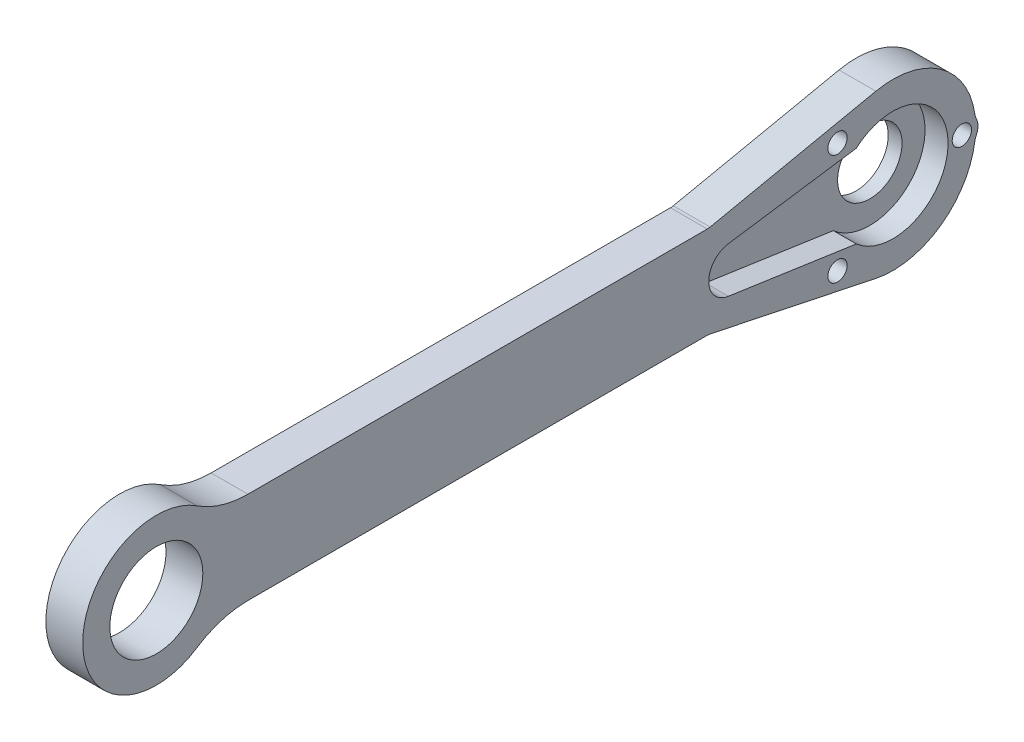
ISO-10303-21;
HEADER;
FILE_DESCRIPTION(('STEP AP214'),'2;1');
FILE_NAME('part.step','',(''),(''),'','','');
FILE_SCHEMA(('AUTOMOTIVE_DESIGN { 1 0 10303 214 1 1 1 1 }'));
ENDSEC;
DATA;
#1=APPLICATION_CONTEXT('core data for automotive mechanical design processes');
#2=APPLICATION_PROTOCOL_DEFINITION('international standard','automotive_design',2000,#1);
#3=PRODUCT_CONTEXT('',#1,'mechanical');
#4=PRODUCT('Part','Part','',(#3));
#5=PRODUCT_RELATED_PRODUCT_CATEGORY('part','',(#4));
#6=PRODUCT_DEFINITION_FORMATION('','',#4);
#7=PRODUCT_DEFINITION_CONTEXT('part definition',#1,'design');
#8=PRODUCT_DEFINITION('design','',#6,#7);
#9=PRODUCT_DEFINITION_SHAPE('','',#8);
#10=(LENGTH_UNIT() NAMED_UNIT(*) SI_UNIT(.MILLI.,.METRE.));
#11=(NAMED_UNIT(*) PLANE_ANGLE_UNIT() SI_UNIT($,.RADIAN.));
#12=(NAMED_UNIT(*) SI_UNIT($,.STERADIAN.) SOLID_ANGLE_UNIT());
#13=UNCERTAINTY_MEASURE_WITH_UNIT(LENGTH_MEASURE(1.E-05),#10,'distance_accuracy_value','');
#14=(GEOMETRIC_REPRESENTATION_CONTEXT(3) GLOBAL_UNCERTAINTY_ASSIGNED_CONTEXT((#13)) GLOBAL_UNIT_ASSIGNED_CONTEXT((#10,
#11,#12)) REPRESENTATION_CONTEXT('',''));
#15=CARTESIAN_POINT('',(0.,0.,0.));
#16=DIRECTION('',(0.,0.,1.));
#17=DIRECTION('',(1.,0.,0.));
#18=AXIS2_PLACEMENT_3D('',#15,#16,#17);
#19=CARTESIAN_POINT('',(4.,0.,0.));
#20=DIRECTION('',(1.,0.,0.));
#21=DIRECTION('',(0.,0.,-1.));
#22=AXIS2_PLACEMENT_3D('',#19,#20,#21);
#23=PLANE('',#22);
#24=CARTESIAN_POINT('',(4.,6.01040764008562,-33.9895923599143));
#25=DIRECTION('',(1.,0.,0.));
#26=DIRECTION('',(0.,0.,-1.));
#27=AXIS2_PLACEMENT_3D('',#24,#25,#26);
#28=CIRCLE('',#27,1.05);
#29=CARTESIAN_POINT('',(4.,6.01040764008562,-35.0395923599143));
#30=VERTEX_POINT('',#29);
#31=EDGE_CURVE('E468',#30,#30,#28,.T.);
#32=ORIENTED_EDGE('',*,*,#31,.F.);
#33=EDGE_LOOP('',(#32));
#34=FACE_BOUND('',#33,.T.);
#35=CARTESIAN_POINT('',(4.,0.,-47.5));
#36=DIRECTION('',(1.,0.,0.));
#37=DIRECTION('',(0.,0.,-1.));
#38=AXIS2_PLACEMENT_3D('',#35,#36,#37);
#39=CIRCLE('',#38,1.75);
#40=CARTESIAN_POINT('',(4.,0.794417713041588,-49.0592948717949));
#41=VERTEX_POINT('',#40);
#42=CARTESIAN_POINT('',(4.,-0.794417713041585,-49.0592948717949));
#43=VERTEX_POINT('',#42);
#44=EDGE_CURVE('E210',#41,#43,#39,.F.);
#45=ORIENTED_EDGE('',*,*,#44,.F.);
#46=CARTESIAN_POINT('',(4.,1.47534718136295,-50.3958333333333));
#47=DIRECTION('',(1.,0.,0.));
#48=DIRECTION('',(0.,0.,-1.));
#49=AXIS2_PLACEMENT_3D('',#46,#47,#48);
#50=CIRCLE('',#49,1.5);
#51=CARTESIAN_POINT('',(4.,1.2645832983111,-48.9107142857143));
#52=VERTEX_POINT('',#51);
#53=EDGE_CURVE('E296',#41,#52,#50,.F.);
#54=ORIENTED_EDGE('',*,*,#53,.T.);
#55=CARTESIAN_POINT('',(4.,0.,-40.));
#56=DIRECTION('',(1.,0.,0.));
#57=DIRECTION('',(0.,0.,-1.));
#58=AXIS2_PLACEMENT_3D('',#55,#56,#57);
#59=CIRCLE('',#58,9.);
#60=CARTESIAN_POINT('',(4.,8.80824154912577,-38.1520603872814));
#61=VERTEX_POINT('',#60);
#62=EDGE_CURVE('E213',#61,#52,#59,.F.);
#63=ORIENTED_EDGE('',*,*,#62,.F.);
#64=DIRECTION('',(0.,0.205326623635395,-0.978693505458419));
#65=VECTOR('',#64,1.);
#66=CARTESIAN_POINT('',(4.,0.770168227139119,0.161578717778108));
#67=LINE('',#66,#65);
#68=CARTESIAN_POINT('',(4.,5.03195974181237,-20.1523367559165));
#69=VERTEX_POINT('',#68);
#70=EDGE_CURVE('E217',#69,#61,#67,.T.);
#71=ORIENTED_EDGE('',*,*,#70,.F.);
#72=CARTESIAN_POINT('',(4.,6.5,-19.8443468204634));
#73=DIRECTION('',(1.,0.,0.));
#74=DIRECTION('',(0.,0.,-1.));
#75=AXIS2_PLACEMENT_3D('',#72,#73,#74);
#76=CIRCLE('',#75,1.5);
#77=CARTESIAN_POINT('',(4.,5.,-19.8443468204634));
#78=VERTEX_POINT('',#77);
#79=EDGE_CURVE('E286',#69,#78,#76,.F.);
#80=ORIENTED_EDGE('',*,*,#79,.T.);
#81=DIRECTION('',(0.,0.,-1.));
#82=VECTOR('',#81,1.);
#83=CARTESIAN_POINT('',(4.,5.,0.));
#84=LINE('',#83,#82);
#85=CARTESIAN_POINT('',(4.,5.,30.0501256289338));
#86=VERTEX_POINT('',#85);
#87=EDGE_CURVE('E219',#86,#78,#84,.T.);
#88=ORIENTED_EDGE('',*,*,#87,.F.);
#89=CARTESIAN_POINT('',(4.,15.,30.0501256289338));
#90=DIRECTION('',(1.,0.,0.));
#91=DIRECTION('',(0.,0.,-1.));
#92=AXIS2_PLACEMENT_3D('',#89,#90,#91);
#93=CIRCLE('',#92,10.);
#94=CARTESIAN_POINT('',(4.,6.66666666666667,35.5778336128595));
#95=VERTEX_POINT('',#94);
#96=EDGE_CURVE('E11',#86,#95,#93,.F.);
#97=ORIENTED_EDGE('',*,*,#96,.T.);
#98=CARTESIAN_POINT('',(4.,0.,40.));
#99=DIRECTION('',(1.,0.,0.));
#100=DIRECTION('',(0.,0.,-1.));
#101=AXIS2_PLACEMENT_3D('',#98,#99,#100);
#102=CIRCLE('',#101,8.);
#103=CARTESIAN_POINT('',(4.,-6.66666666666667,35.5778336128595));
#104=VERTEX_POINT('',#103);
#105=EDGE_CURVE('E221',#95,#104,#102,.T.);
#106=ORIENTED_EDGE('',*,*,#105,.T.);
#107=CARTESIAN_POINT('',(4.,-15.,30.0501256289338));
#108=DIRECTION('',(1.,0.,0.));
#109=DIRECTION('',(0.,0.,-1.));
#110=AXIS2_PLACEMENT_3D('',#107,#108,#109);
#111=CIRCLE('',#110,10.);
#112=CARTESIAN_POINT('',(4.,-5.,30.0501256289338));
#113=VERTEX_POINT('',#112);
#114=EDGE_CURVE('E313',#104,#113,#111,.F.);
#115=ORIENTED_EDGE('',*,*,#114,.T.);
#116=DIRECTION('',(0.,0.,-1.));
#117=VECTOR('',#116,1.);
#118=CARTESIAN_POINT('',(4.,-5.,0.));
#119=LINE('',#118,#117);
#120=CARTESIAN_POINT('',(4.,-5.,-19.8443468204634));
#121=VERTEX_POINT('',#120);
#122=EDGE_CURVE('E224',#113,#121,#119,.T.);
#123=ORIENTED_EDGE('',*,*,#122,.T.);
#124=CARTESIAN_POINT('',(4.,-6.5,-19.8443468204634));
#125=DIRECTION('',(1.,0.,0.));
#126=DIRECTION('',(0.,0.,-1.));
#127=AXIS2_PLACEMENT_3D('',#124,#125,#126);
#128=CIRCLE('',#127,1.5);
#129=CARTESIAN_POINT('',(4.,-5.03195974181237,-20.1523367559165));
#130=VERTEX_POINT('',#129);
#131=EDGE_CURVE('E292',#121,#130,#128,.F.);
#132=ORIENTED_EDGE('',*,*,#131,.T.);
#133=DIRECTION('',(0.,-0.205326623635395,-0.978693505458419));
#134=VECTOR('',#133,1.);
#135=CARTESIAN_POINT('',(4.,-0.770168227139119,0.161578717778108));
#136=LINE('',#135,#134);
#137=CARTESIAN_POINT('',(4.,-8.80824154912577,-38.1520603872814));
#138=VERTEX_POINT('',#137);
#139=EDGE_CURVE('E226',#130,#138,#136,.T.);
#140=ORIENTED_EDGE('',*,*,#139,.T.);
#141=CARTESIAN_POINT('',(4.,0.,-40.));
#142=DIRECTION('',(1.,0.,0.));
#143=DIRECTION('',(0.,0.,-1.));
#144=AXIS2_PLACEMENT_3D('',#141,#142,#143);
#145=CIRCLE('',#144,9.);
#146=CARTESIAN_POINT('',(4.,-1.26458329831109,-48.9107142857143));
#147=VERTEX_POINT('',#146);
#148=EDGE_CURVE('E228',#138,#147,#145,.T.);
#149=ORIENTED_EDGE('',*,*,#148,.T.);
#150=CARTESIAN_POINT('',(4.,-1.47534718136294,-50.3958333333333));
#151=DIRECTION('',(1.,0.,0.));
#152=DIRECTION('',(0.,0.,-1.));
#153=AXIS2_PLACEMENT_3D('',#150,#151,#152);
#154=CIRCLE('',#153,1.5);
#155=EDGE_CURVE('E300',#147,#43,#154,.F.);
#156=ORIENTED_EDGE('',*,*,#155,.T.);
#157=EDGE_LOOP('',(#45,#54,#63,#71,#80,#88,#97,#106,#115,#123,#132,#140,#149,#156));
#158=FACE_BOUND('',#157,.T.);
#159=CARTESIAN_POINT('',(4.,0.,40.));
#160=DIRECTION('',(1.,0.,0.));
#161=DIRECTION('',(0.,0.,-1.));
#162=AXIS2_PLACEMENT_3D('',#159,#160,#161);
#163=CIRCLE('',#162,5.05);
#164=CARTESIAN_POINT('',(4.,0.,34.95));
#165=VERTEX_POINT('',#164);
#166=EDGE_CURVE('E206',#165,#165,#163,.T.);
#167=ORIENTED_EDGE('',*,*,#166,.F.);
#168=EDGE_LOOP('',(#167));
#169=FACE_BOUND('',#168,.T.);
#170=DIRECTION('',(0.,-0.144322964314915,-0.989530637207032));
#171=VECTOR('',#170,1.);
#172=CARTESIAN_POINT('',(4.,-2.47382659301758,-22.1391925892127));
#173=LINE('',#172,#171);
#174=CARTESIAN_POINT('',(4.,-2.47382659301758,-22.1391925892127));
#175=VERTEX_POINT('',#174);
#176=CARTESIAN_POINT('',(4.,-4.5,-36.0313730334031));
#177=VERTEX_POINT('',#176);
#178=EDGE_CURVE('E165',#175,#177,#173,.T.);
#179=ORIENTED_EDGE('',*,*,#178,.F.);
#180=CARTESIAN_POINT('',(4.,0.,-22.5));
#181=DIRECTION('',(-1.,0.,0.));
#182=DIRECTION('',(0.,0.,1.));
#183=AXIS2_PLACEMENT_3D('',#180,#181,#182);
#184=CIRCLE('',#183,2.5);
#185=CARTESIAN_POINT('',(4.,2.47382659301758,-22.1391925892127));
#186=VERTEX_POINT('',#185);
#187=EDGE_CURVE('E183',#175,#186,#184,.T.);
#188=ORIENTED_EDGE('',*,*,#187,.T.);
#189=DIRECTION('',(0.,0.144322964314915,-0.989530637207032));
#190=VECTOR('',#189,1.);
#191=CARTESIAN_POINT('',(4.,2.47382659301758,-22.1391925892127));
#192=LINE('',#191,#190);
#193=CARTESIAN_POINT('',(4.,4.5,-36.0313730334031));
#194=VERTEX_POINT('',#193);
#195=EDGE_CURVE('E186',#186,#194,#192,.T.);
#196=ORIENTED_EDGE('',*,*,#195,.T.);
#197=CARTESIAN_POINT('',(4.,0.,-40.));
#198=DIRECTION('',(1.,0.,0.));
#199=DIRECTION('',(0.,0.,-1.));
#200=AXIS2_PLACEMENT_3D('',#197,#198,#199);
#201=CIRCLE('',#200,6.);
#202=EDGE_CURVE('E195',#177,#194,#201,.T.);
#203=ORIENTED_EDGE('',*,*,#202,.F.);
#204=EDGE_LOOP('',(#179,#188,#196,#203));
#205=FACE_BOUND('',#204,.T.);
#206=CARTESIAN_POINT('',(4.,0.,-47.5));
#207=DIRECTION('',(1.,0.,0.));
#208=DIRECTION('',(0.,0.,-1.));
#209=AXIS2_PLACEMENT_3D('',#206,#207,#208);
#210=CIRCLE('',#209,1.05);
#211=CARTESIAN_POINT('',(4.,0.,-48.55));
#212=VERTEX_POINT('',#211);
#213=EDGE_CURVE('E459',#212,#212,#210,.T.);
#214=ORIENTED_EDGE('',*,*,#213,.F.);
#215=EDGE_LOOP('',(#214));
#216=FACE_BOUND('',#215,.T.);
#217=CARTESIAN_POINT('',(4.,-6.01040764008562,-33.9895923599143));
#218=DIRECTION('',(-1.,0.,0.));
#219=DIRECTION('',(0.,0.,1.));
#220=AXIS2_PLACEMENT_3D('',#217,#218,#219);
#221=CIRCLE('',#220,1.05);
#222=CARTESIAN_POINT('',(4.,-6.01040764008562,-32.9395923599143));
#223=VERTEX_POINT('',#222);
#224=EDGE_CURVE('E463',#223,#223,#221,.T.);
#225=ORIENTED_EDGE('',*,*,#224,.T.);
#226=EDGE_LOOP('',(#225));
#227=FACE_BOUND('',#226,.T.);
#228=ADVANCED_FACE('F36',(#34,#158,#169,#205,#216,#227),#23,.T.);
#229=CARTESIAN_POINT('',(0.,0.,0.));
#230=DIRECTION('',(1.,0.,0.));
#231=DIRECTION('',(0.,0.,-1.));
#232=AXIS2_PLACEMENT_3D('',#229,#230,#231);
#233=PLANE('',#232);
#234=CARTESIAN_POINT('',(0.,6.01040764008562,-33.9895923599143));
#235=DIRECTION('',(1.,0.,0.));
#236=DIRECTION('',(0.,0.,-1.));
#237=AXIS2_PLACEMENT_3D('',#234,#235,#236);
#238=CIRCLE('',#237,1.05);
#239=CARTESIAN_POINT('',(0.,6.01040764008562,-35.0395923599143));
#240=VERTEX_POINT('',#239);
#241=EDGE_CURVE('E196',#240,#240,#238,.T.);
#242=ORIENTED_EDGE('',*,*,#241,.T.);
#243=EDGE_LOOP('',(#242));
#244=FACE_BOUND('',#243,.T.);
#245=CARTESIAN_POINT('',(0.,0.,-47.5));
#246=DIRECTION('',(1.,0.,0.));
#247=DIRECTION('',(0.,0.,-1.));
#248=AXIS2_PLACEMENT_3D('',#245,#246,#247);
#249=CIRCLE('',#248,1.05);
#250=CARTESIAN_POINT('',(0.,0.,-48.55));
#251=VERTEX_POINT('',#250);
#252=EDGE_CURVE('E189',#251,#251,#249,.T.);
#253=ORIENTED_EDGE('',*,*,#252,.T.);
#254=EDGE_LOOP('',(#253));
#255=FACE_BOUND('',#254,.T.);
#256=CARTESIAN_POINT('',(0.,0.,40.));
#257=DIRECTION('',(1.,0.,0.));
#258=DIRECTION('',(0.,0.,-1.));
#259=AXIS2_PLACEMENT_3D('',#256,#257,#258);
#260=CIRCLE('',#259,5.05);
#261=CARTESIAN_POINT('',(0.,0.,34.95));
#262=VERTEX_POINT('',#261);
#263=EDGE_CURVE('E236',#262,#262,#260,.T.);
#264=ORIENTED_EDGE('',*,*,#263,.T.);
#265=EDGE_LOOP('',(#264));
#266=FACE_BOUND('',#265,.T.);
#267=CARTESIAN_POINT('',(0.,0.,-40.));
#268=DIRECTION('',(1.,0.,0.));
#269=DIRECTION('',(0.,0.,-1.));
#270=AXIS2_PLACEMENT_3D('',#267,#268,#269);
#271=CIRCLE('',#270,3.5);
#272=CARTESIAN_POINT('',(0.,0.,-43.5));
#273=VERTEX_POINT('',#272);
#274=EDGE_CURVE('E209',#273,#273,#271,.T.);
#275=ORIENTED_EDGE('',*,*,#274,.T.);
#276=EDGE_LOOP('',(#275));
#277=FACE_BOUND('',#276,.T.);
#278=CARTESIAN_POINT('',(0.,0.,-40.));
#279=DIRECTION('',(1.,0.,0.));
#280=DIRECTION('',(0.,0.,-1.));
#281=AXIS2_PLACEMENT_3D('',#278,#279,#280);
#282=CIRCLE('',#281,9.);
#283=CARTESIAN_POINT('',(0.,8.80824154912577,-38.1520603872814));
#284=VERTEX_POINT('',#283);
#285=CARTESIAN_POINT('',(0.,1.2645832983111,-48.9107142857143));
#286=VERTEX_POINT('',#285);
#287=EDGE_CURVE('E235',#284,#286,#282,.F.);
#288=ORIENTED_EDGE('',*,*,#287,.T.);
#289=CARTESIAN_POINT('',(0.,1.47534718136295,-50.3958333333333));
#290=DIRECTION('',(1.,0.,0.));
#291=DIRECTION('',(0.,0.,-1.));
#292=AXIS2_PLACEMENT_3D('',#289,#290,#291);
#293=CIRCLE('',#292,1.5);
#294=CARTESIAN_POINT('',(0.,0.794417713041588,-49.0592948717949));
#295=VERTEX_POINT('',#294);
#296=EDGE_CURVE('E294',#286,#295,#293,.T.);
#297=ORIENTED_EDGE('',*,*,#296,.T.);
#298=CARTESIAN_POINT('',(0.,0.,-47.5));
#299=DIRECTION('',(1.,0.,0.));
#300=DIRECTION('',(0.,0.,-1.));
#301=AXIS2_PLACEMENT_3D('',#298,#299,#300);
#302=CIRCLE('',#301,1.75);
#303=CARTESIAN_POINT('',(0.,-0.794417713041585,-49.0592948717949));
#304=VERTEX_POINT('',#303);
#305=EDGE_CURVE('E232',#295,#304,#302,.F.);
#306=ORIENTED_EDGE('',*,*,#305,.T.);
#307=CARTESIAN_POINT('',(0.,-1.47534718136294,-50.3958333333333));
#308=DIRECTION('',(1.,0.,0.));
#309=DIRECTION('',(0.,0.,-1.));
#310=AXIS2_PLACEMENT_3D('',#307,#308,#309);
#311=CIRCLE('',#310,1.5);
#312=CARTESIAN_POINT('',(0.,-1.26458329831109,-48.9107142857143));
#313=VERTEX_POINT('',#312);
#314=EDGE_CURVE('E298',#304,#313,#311,.T.);
#315=ORIENTED_EDGE('',*,*,#314,.T.);
#316=CARTESIAN_POINT('',(0.,0.,-40.));
#317=DIRECTION('',(1.,0.,0.));
#318=DIRECTION('',(0.,0.,-1.));
#319=AXIS2_PLACEMENT_3D('',#316,#317,#318);
#320=CIRCLE('',#319,9.);
#321=CARTESIAN_POINT('',(0.,-8.80824154912577,-38.1520603872814));
#322=VERTEX_POINT('',#321);
#323=EDGE_CURVE('E214',#322,#313,#320,.T.);
#324=ORIENTED_EDGE('',*,*,#323,.F.);
#325=DIRECTION('',(0.,-0.205326623635395,-0.978693505458419));
#326=VECTOR('',#325,1.);
#327=CARTESIAN_POINT('',(0.,-0.770168227139119,0.161578717778108));
#328=LINE('',#327,#326);
#329=CARTESIAN_POINT('',(0.,-5.03195974181237,-20.1523367559165));
#330=VERTEX_POINT('',#329);
#331=EDGE_CURVE('E248',#330,#322,#328,.T.);
#332=ORIENTED_EDGE('',*,*,#331,.F.);
#333=CARTESIAN_POINT('',(0.,-6.5,-19.8443468204634));
#334=DIRECTION('',(1.,0.,0.));
#335=DIRECTION('',(0.,0.,-1.));
#336=AXIS2_PLACEMENT_3D('',#333,#334,#335);
#337=CIRCLE('',#336,1.5);
#338=CARTESIAN_POINT('',(0.,-5.,-19.8443468204634));
#339=VERTEX_POINT('',#338);
#340=EDGE_CURVE('E289',#330,#339,#337,.T.);
#341=ORIENTED_EDGE('',*,*,#340,.T.);
#342=DIRECTION('',(0.,0.,-1.));
#343=VECTOR('',#342,1.);
#344=CARTESIAN_POINT('',(0.,-5.,0.));
#345=LINE('',#344,#343);
#346=CARTESIAN_POINT('',(0.,-5.,30.0501256289338));
#347=VERTEX_POINT('',#346);
#348=EDGE_CURVE('E246',#347,#339,#345,.T.);
#349=ORIENTED_EDGE('',*,*,#348,.F.);
#350=CARTESIAN_POINT('',(0.,-15.,30.0501256289338));
#351=DIRECTION('',(1.,0.,0.));
#352=DIRECTION('',(0.,0.,-1.));
#353=AXIS2_PLACEMENT_3D('',#350,#351,#352);
#354=CIRCLE('',#353,10.);
#355=CARTESIAN_POINT('',(0.,-6.66666666666667,35.5778336128595));
#356=VERTEX_POINT('',#355);
#357=EDGE_CURVE('E311',#347,#356,#354,.T.);
#358=ORIENTED_EDGE('',*,*,#357,.T.);
#359=CARTESIAN_POINT('',(0.,0.,40.));
#360=DIRECTION('',(1.,0.,0.));
#361=DIRECTION('',(0.,0.,-1.));
#362=AXIS2_PLACEMENT_3D('',#359,#360,#361);
#363=CIRCLE('',#362,8.);
#364=CARTESIAN_POINT('',(0.,6.66666666666667,35.5778336128595));
#365=VERTEX_POINT('',#364);
#366=EDGE_CURVE('E243',#365,#356,#363,.T.);
#367=ORIENTED_EDGE('',*,*,#366,.F.);
#368=CARTESIAN_POINT('',(0.,15.,30.0501256289338));
#369=DIRECTION('',(1.,0.,0.));
#370=DIRECTION('',(0.,0.,-1.));
#371=AXIS2_PLACEMENT_3D('',#368,#369,#370);
#372=CIRCLE('',#371,10.);
#373=CARTESIAN_POINT('',(0.,5.,30.0501256289338));
#374=VERTEX_POINT('',#373);
#375=EDGE_CURVE('E44',#365,#374,#372,.T.);
#376=ORIENTED_EDGE('',*,*,#375,.T.);
#377=DIRECTION('',(0.,0.,-1.));
#378=VECTOR('',#377,1.);
#379=CARTESIAN_POINT('',(0.,5.,0.));
#380=LINE('',#379,#378);
#381=CARTESIAN_POINT('',(0.,5.,-19.8443468204634));
#382=VERTEX_POINT('',#381);
#383=EDGE_CURVE('E241',#374,#382,#380,.T.);
#384=ORIENTED_EDGE('',*,*,#383,.T.);
#385=CARTESIAN_POINT('',(0.,6.5,-19.8443468204634));
#386=DIRECTION('',(1.,0.,0.));
#387=DIRECTION('',(0.,0.,-1.));
#388=AXIS2_PLACEMENT_3D('',#385,#386,#387);
#389=CIRCLE('',#388,1.5);
#390=CARTESIAN_POINT('',(0.,5.03195974181237,-20.1523367559165));
#391=VERTEX_POINT('',#390);
#392=EDGE_CURVE('E284',#382,#391,#389,.T.);
#393=ORIENTED_EDGE('',*,*,#392,.T.);
#394=DIRECTION('',(0.,0.205326623635395,-0.978693505458419));
#395=VECTOR('',#394,1.);
#396=CARTESIAN_POINT('',(0.,0.770168227139119,0.161578717778108));
#397=LINE('',#396,#395);
#398=EDGE_CURVE('E239',#391,#284,#397,.T.);
#399=ORIENTED_EDGE('',*,*,#398,.T.);
#400=EDGE_LOOP('',(#288,#297,#306,#315,#324,#332,#341,#349,#358,#367,#376,#384,#393,#399));
#401=FACE_BOUND('',#400,.T.);
#402=CARTESIAN_POINT('',(0.,-6.01040764008562,-33.9895923599143));
#403=DIRECTION('',(-1.,0.,0.));
#404=DIRECTION('',(0.,0.,1.));
#405=AXIS2_PLACEMENT_3D('',#402,#403,#404);
#406=CIRCLE('',#405,1.05);
#407=CARTESIAN_POINT('',(0.,-6.01040764008562,-32.9395923599143));
#408=VERTEX_POINT('',#407);
#409=EDGE_CURVE('E461',#408,#408,#406,.T.);
#410=ORIENTED_EDGE('',*,*,#409,.F.);
#411=EDGE_LOOP('',(#410));
#412=FACE_BOUND('',#411,.T.);
#413=ADVANCED_FACE('F329',(#244,#255,#266,#277,#401,#412),#233,.F.);
#414=CARTESIAN_POINT('',(-6.,0.,-40.));
#415=DIRECTION('',(1.,0.,0.));
#416=DIRECTION('',(0.,0.,-1.));
#417=AXIS2_PLACEMENT_3D('',#414,#415,#416);
#418=CYLINDRICAL_SURFACE('',#417,3.5);
#419=ORIENTED_EDGE('',*,*,#274,.F.);
#420=EDGE_LOOP('',(#419));
#421=FACE_BOUND('',#420,.T.);
#422=CARTESIAN_POINT('',(1.5,0.,-40.));
#423=DIRECTION('',(1.,0.,0.));
#424=DIRECTION('',(0.,0.,-1.));
#425=AXIS2_PLACEMENT_3D('',#422,#423,#424);
#426=CIRCLE('',#425,3.5);
#427=CARTESIAN_POINT('',(1.5,0.,-43.5));
#428=VERTEX_POINT('',#427);
#429=EDGE_CURVE('E202',#428,#428,#426,.F.);
#430=ORIENTED_EDGE('',*,*,#429,.F.);
#431=EDGE_LOOP('',(#430));
#432=FACE_BOUND('',#431,.T.);
#433=ADVANCED_FACE('F392',(#421,#432),#418,.F.);
#434=CARTESIAN_POINT('',(4.,0.,-47.5));
#435=DIRECTION('',(-1.,0.,0.));
#436=DIRECTION('',(0.,0.,1.));
#437=AXIS2_PLACEMENT_3D('',#434,#435,#436);
#438=CYLINDRICAL_SURFACE('',#437,1.75);
#439=ORIENTED_EDGE('',*,*,#305,.F.);
#440=DIRECTION('',(-1.,0.,0.));
#441=VECTOR('',#440,1.);
#442=CARTESIAN_POINT('',(4.,0.794417713041588,-49.0592948717949));
#443=LINE('',#442,#441);
#444=EDGE_CURVE('E280',#295,#41,#443,.F.);
#445=ORIENTED_EDGE('',*,*,#444,.T.);
#446=ORIENTED_EDGE('',*,*,#44,.T.);
#447=DIRECTION('',(-1.,0.,0.));
#448=VECTOR('',#447,1.);
#449=CARTESIAN_POINT('',(4.,-0.794417713041584,-49.0592948717949));
#450=LINE('',#449,#448);
#451=EDGE_CURVE('E277',#43,#304,#450,.T.);
#452=ORIENTED_EDGE('',*,*,#451,.T.);
#453=EDGE_LOOP('',(#439,#445,#446,#452));
#454=FACE_BOUND('',#453,.T.);
#455=ADVANCED_FACE('F357',(#454),#438,.T.);
#456=CARTESIAN_POINT('',(4.,0.,-40.));
#457=DIRECTION('',(-1.,0.,0.));
#458=DIRECTION('',(0.,0.,1.));
#459=AXIS2_PLACEMENT_3D('',#456,#457,#458);
#460=CYLINDRICAL_SURFACE('',#459,9.);
#461=ORIENTED_EDGE('',*,*,#62,.T.);
#462=DIRECTION('',(-1.,0.,0.));
#463=VECTOR('',#462,1.);
#464=CARTESIAN_POINT('',(4.,1.2645832983111,-48.9107142857143));
#465=LINE('',#464,#463);
#466=EDGE_CURVE('E274',#52,#286,#465,.T.);
#467=ORIENTED_EDGE('',*,*,#466,.T.);
#468=ORIENTED_EDGE('',*,*,#287,.F.);
#469=DIRECTION('',(-1.,0.,0.));
#470=VECTOR('',#469,1.);
#471=CARTESIAN_POINT('',(4.,8.80824154912577,-38.1520603872814));
#472=LINE('',#471,#470);
#473=EDGE_CURVE('E254',#61,#284,#472,.T.);
#474=ORIENTED_EDGE('',*,*,#473,.F.);
#475=EDGE_LOOP('',(#461,#467,#468,#474));
#476=FACE_BOUND('',#475,.T.);
#477=ADVANCED_FACE('F351',(#476),#460,.T.);
#478=CARTESIAN_POINT('',(4.,0.770168227139119,0.161578717778108));
#479=DIRECTION('',(0.,0.978693505458419,0.205326623635395));
#480=DIRECTION('',(0.,-0.205326623635395,0.978693505458419));
#481=AXIS2_PLACEMENT_3D('',#478,#479,#480);
#482=PLANE('',#481);
#483=ORIENTED_EDGE('',*,*,#398,.F.);
#484=DIRECTION('',(-1.,0.,0.));
#485=VECTOR('',#484,1.);
#486=CARTESIAN_POINT('',(4.,5.03195974181237,-20.1523367559165));
#487=LINE('',#486,#485);
#488=EDGE_CURVE('E266',#391,#69,#487,.F.);
#489=ORIENTED_EDGE('',*,*,#488,.T.);
#490=ORIENTED_EDGE('',*,*,#70,.T.);
#491=ORIENTED_EDGE('',*,*,#473,.T.);
#492=EDGE_LOOP('',(#483,#489,#490,#491));
#493=FACE_BOUND('',#492,.T.);
#494=ADVANCED_FACE('F346',(#493),#482,.T.);
#495=CARTESIAN_POINT('',(4.,5.,0.));
#496=DIRECTION('',(0.,1.,0.));
#497=DIRECTION('',(0.,0.,1.));
#498=AXIS2_PLACEMENT_3D('',#495,#496,#497);
#499=PLANE('',#498);
#500=ORIENTED_EDGE('',*,*,#383,.F.);
#501=DIRECTION('',(-1.,0.,0.));
#502=VECTOR('',#501,1.);
#503=CARTESIAN_POINT('',(4.,5.,30.0501256289338));
#504=LINE('',#503,#502);
#505=EDGE_CURVE('E57',#374,#86,#504,.F.);
#506=ORIENTED_EDGE('',*,*,#505,.T.);
#507=ORIENTED_EDGE('',*,*,#87,.T.);
#508=DIRECTION('',(-1.,0.,0.));
#509=VECTOR('',#508,1.);
#510=CARTESIAN_POINT('',(0.,5.,-19.8443468204634));
#511=LINE('',#510,#509);
#512=EDGE_CURVE('E257',#78,#382,#511,.T.);
#513=ORIENTED_EDGE('',*,*,#512,.T.);
#514=EDGE_LOOP('',(#500,#506,#507,#513));
#515=FACE_BOUND('',#514,.T.);
#516=ADVANCED_FACE('F339',(#515),#499,.T.);
#517=CARTESIAN_POINT('',(4.,0.,40.));
#518=DIRECTION('',(-1.,0.,0.));
#519=DIRECTION('',(0.,0.,1.));
#520=AXIS2_PLACEMENT_3D('',#517,#518,#519);
#521=CYLINDRICAL_SURFACE('',#520,8.);
#522=ORIENTED_EDGE('',*,*,#366,.T.);
#523=DIRECTION('',(-1.,0.,0.));
#524=VECTOR('',#523,1.);
#525=CARTESIAN_POINT('',(4.,-6.66666666666667,35.5778336128595));
#526=LINE('',#525,#524);
#527=EDGE_CURVE('E308',#356,#104,#526,.F.);
#528=ORIENTED_EDGE('',*,*,#527,.T.);
#529=ORIENTED_EDGE('',*,*,#105,.F.);
#530=DIRECTION('',(-1.,0.,0.));
#531=VECTOR('',#530,1.);
#532=CARTESIAN_POINT('',(4.,6.66666666666667,35.5778336128595));
#533=LINE('',#532,#531);
#534=EDGE_CURVE('E305',#95,#365,#533,.T.);
#535=ORIENTED_EDGE('',*,*,#534,.T.);
#536=EDGE_LOOP('',(#522,#528,#529,#535));
#537=FACE_BOUND('',#536,.T.);
#538=ADVANCED_FACE('F332',(#537),#521,.T.);
#539=CARTESIAN_POINT('',(4.,-5.,0.));
#540=DIRECTION('',(0.,1.,0.));
#541=DIRECTION('',(0.,0.,1.));
#542=AXIS2_PLACEMENT_3D('',#539,#540,#541);
#543=PLANE('',#542);
#544=ORIENTED_EDGE('',*,*,#122,.F.);
#545=DIRECTION('',(1.,0.,0.));
#546=VECTOR('',#545,1.);
#547=CARTESIAN_POINT('',(0.,-5.,30.0501256289338));
#548=LINE('',#547,#546);
#549=EDGE_CURVE('E302',#113,#347,#548,.F.);
#550=ORIENTED_EDGE('',*,*,#549,.T.);
#551=ORIENTED_EDGE('',*,*,#348,.T.);
#552=DIRECTION('',(-1.,0.,0.));
#553=VECTOR('',#552,1.);
#554=CARTESIAN_POINT('',(4.,-5.,-19.8443468204634));
#555=LINE('',#554,#553);
#556=EDGE_CURVE('E271',#339,#121,#555,.F.);
#557=ORIENTED_EDGE('',*,*,#556,.T.);
#558=EDGE_LOOP('',(#544,#550,#551,#557));
#559=FACE_BOUND('',#558,.T.);
#560=ADVANCED_FACE('F324',(#559),#543,.F.);
#561=CARTESIAN_POINT('',(4.,-0.770168227139119,0.161578717778108));
#562=DIRECTION('',(0.,0.978693505458419,-0.205326623635395));
#563=DIRECTION('',(0.,0.205326623635395,0.978693505458419));
#564=AXIS2_PLACEMENT_3D('',#561,#562,#563);
#565=PLANE('',#564);
#566=ORIENTED_EDGE('',*,*,#139,.F.);
#567=DIRECTION('',(-1.,0.,0.));
#568=VECTOR('',#567,1.);
#569=CARTESIAN_POINT('',(0.,-5.03195974181237,-20.1523367559165));
#570=LINE('',#569,#568);
#571=EDGE_CURVE('E268',#130,#330,#570,.T.);
#572=ORIENTED_EDGE('',*,*,#571,.T.);
#573=ORIENTED_EDGE('',*,*,#331,.T.);
#574=DIRECTION('',(-1.,0.,0.));
#575=VECTOR('',#574,1.);
#576=CARTESIAN_POINT('',(4.,-8.80824154912577,-38.1520603872814));
#577=LINE('',#576,#575);
#578=EDGE_CURVE('E231',#138,#322,#577,.T.);
#579=ORIENTED_EDGE('',*,*,#578,.F.);
#580=EDGE_LOOP('',(#566,#572,#573,#579));
#581=FACE_BOUND('',#580,.T.);
#582=ADVANCED_FACE('F373',(#581),#565,.F.);
#583=CARTESIAN_POINT('',(4.,0.,-40.));
#584=DIRECTION('',(-1.,0.,0.));
#585=DIRECTION('',(0.,0.,1.));
#586=AXIS2_PLACEMENT_3D('',#583,#584,#585);
#587=CYLINDRICAL_SURFACE('',#586,9.);
#588=ORIENTED_EDGE('',*,*,#323,.T.);
#589=DIRECTION('',(-1.,0.,0.));
#590=VECTOR('',#589,1.);
#591=CARTESIAN_POINT('',(4.,-1.26458329831109,-48.9107142857143));
#592=LINE('',#591,#590);
#593=EDGE_CURVE('E282',#313,#147,#592,.F.);
#594=ORIENTED_EDGE('',*,*,#593,.T.);
#595=ORIENTED_EDGE('',*,*,#148,.F.);
#596=ORIENTED_EDGE('',*,*,#578,.T.);
#597=EDGE_LOOP('',(#588,#594,#595,#596));
#598=FACE_BOUND('',#597,.T.);
#599=ADVANCED_FACE('F368',(#598),#587,.T.);
#600=CARTESIAN_POINT('',(-6.,0.,40.));
#601=DIRECTION('',(1.,0.,0.));
#602=DIRECTION('',(0.,0.,-1.));
#603=AXIS2_PLACEMENT_3D('',#600,#601,#602);
#604=CYLINDRICAL_SURFACE('',#603,5.05);
#605=ORIENTED_EDGE('',*,*,#166,.T.);
#606=EDGE_LOOP('',(#605));
#607=FACE_BOUND('',#606,.T.);
#608=ORIENTED_EDGE('',*,*,#263,.F.);
#609=EDGE_LOOP('',(#608));
#610=FACE_BOUND('',#609,.T.);
#611=ADVANCED_FACE('F401',(#607,#610),#604,.F.);
#612=CARTESIAN_POINT('',(1.5,0.,-40.));
#613=DIRECTION('',(1.,0.,0.));
#614=DIRECTION('',(0.,0.,-1.));
#615=AXIS2_PLACEMENT_3D('',#612,#613,#614);
#616=PLANE('',#615);
#617=DIRECTION('',(0.,-0.144322964314915,-0.989530637207032));
#618=VECTOR('',#617,1.);
#619=CARTESIAN_POINT('',(1.5,-2.47382659301758,-22.1391925892127));
#620=LINE('',#619,#618);
#621=CARTESIAN_POINT('',(1.5,-2.47382659301758,-22.1391925892127));
#622=VERTEX_POINT('',#621);
#623=CARTESIAN_POINT('',(1.5,-4.5,-36.0313730334031));
#624=VERTEX_POINT('',#623);
#625=EDGE_CURVE('E163',#622,#624,#620,.T.);
#626=ORIENTED_EDGE('',*,*,#625,.T.);
#627=CARTESIAN_POINT('',(1.5,0.,-40.));
#628=DIRECTION('',(1.,0.,0.));
#629=DIRECTION('',(0.,0.,-1.));
#630=AXIS2_PLACEMENT_3D('',#627,#628,#629);
#631=CIRCLE('',#630,6.);
#632=CARTESIAN_POINT('',(1.5,4.5,-36.0313730334031));
#633=VERTEX_POINT('',#632);
#634=EDGE_CURVE('E174',#624,#633,#631,.T.);
#635=ORIENTED_EDGE('',*,*,#634,.T.);
#636=DIRECTION('',(0.,0.144322964314915,-0.989530637207032));
#637=VECTOR('',#636,1.);
#638=CARTESIAN_POINT('',(1.5,2.47382659301758,-22.1391925892127));
#639=LINE('',#638,#637);
#640=CARTESIAN_POINT('',(1.5,2.47382659301758,-22.1391925892127));
#641=VERTEX_POINT('',#640);
#642=EDGE_CURVE('E178',#641,#633,#639,.T.);
#643=ORIENTED_EDGE('',*,*,#642,.F.);
#644=CARTESIAN_POINT('',(1.5,0.,-22.5));
#645=DIRECTION('',(-1.,0.,0.));
#646=DIRECTION('',(0.,0.,1.));
#647=AXIS2_PLACEMENT_3D('',#644,#645,#646);
#648=CIRCLE('',#647,2.5);
#649=EDGE_CURVE('E170',#622,#641,#648,.T.);
#650=ORIENTED_EDGE('',*,*,#649,.F.);
#651=EDGE_LOOP('',(#626,#635,#643,#650));
#652=FACE_BOUND('',#651,.T.);
#653=ORIENTED_EDGE('',*,*,#429,.T.);
#654=EDGE_LOOP('',(#653));
#655=FACE_BOUND('',#654,.T.);
#656=ADVANCED_FACE('F181',(#652,#655),#616,.T.);
#657=CARTESIAN_POINT('',(1.5,-2.47382659301758,-22.1391925892127));
#658=DIRECTION('',(0.,-0.989530637207032,0.144322964314915));
#659=DIRECTION('',(0.,-0.144322964314915,-0.989530637207032));
#660=AXIS2_PLACEMENT_3D('',#657,#658,#659);
#661=PLANE('',#660);
#662=ORIENTED_EDGE('',*,*,#178,.T.);
#663=DIRECTION('',(1.,0.,0.));
#664=VECTOR('',#663,1.);
#665=CARTESIAN_POINT('',(1.5,-4.5,-36.0313730334031));
#666=LINE('',#665,#664);
#667=EDGE_CURVE('E159',#624,#177,#666,.T.);
#668=ORIENTED_EDGE('',*,*,#667,.F.);
#669=ORIENTED_EDGE('',*,*,#625,.F.);
#670=DIRECTION('',(1.,0.,0.));
#671=VECTOR('',#670,1.);
#672=CARTESIAN_POINT('',(1.5,-2.47382659301758,-22.1391925892127));
#673=LINE('',#672,#671);
#674=EDGE_CURVE('E200',#622,#175,#673,.T.);
#675=ORIENTED_EDGE('',*,*,#674,.T.);
#676=EDGE_LOOP('',(#662,#668,#669,#675));
#677=FACE_BOUND('',#676,.T.);
#678=ADVANCED_FACE('F161',(#677),#661,.F.);
#679=CARTESIAN_POINT('',(1.5,0.,-22.5));
#680=DIRECTION('',(1.,0.,0.));
#681=DIRECTION('',(0.,0.,-1.));
#682=AXIS2_PLACEMENT_3D('',#679,#680,#681);
#683=CYLINDRICAL_SURFACE('',#682,2.5);
#684=ORIENTED_EDGE('',*,*,#187,.F.);
#685=ORIENTED_EDGE('',*,*,#674,.F.);
#686=ORIENTED_EDGE('',*,*,#649,.T.);
#687=DIRECTION('',(1.,0.,0.));
#688=VECTOR('',#687,1.);
#689=CARTESIAN_POINT('',(1.5,2.47382659301758,-22.1391925892127));
#690=LINE('',#689,#688);
#691=EDGE_CURVE('E203',#641,#186,#690,.T.);
#692=ORIENTED_EDGE('',*,*,#691,.T.);
#693=EDGE_LOOP('',(#684,#685,#686,#692));
#694=FACE_BOUND('',#693,.T.);
#695=ADVANCED_FACE('F430',(#694),#683,.F.);
#696=CARTESIAN_POINT('',(1.5,2.47382659301758,-22.1391925892127));
#697=DIRECTION('',(0.,-0.989530637207032,-0.144322964314915));
#698=DIRECTION('',(0.,0.144322964314915,-0.989530637207032));
#699=AXIS2_PLACEMENT_3D('',#696,#697,#698);
#700=PLANE('',#699);
#701=ORIENTED_EDGE('',*,*,#195,.F.);
#702=ORIENTED_EDGE('',*,*,#691,.F.);
#703=ORIENTED_EDGE('',*,*,#642,.T.);
#704=DIRECTION('',(1.,0.,0.));
#705=VECTOR('',#704,1.);
#706=CARTESIAN_POINT('',(1.5,4.5,-36.0313730334031));
#707=LINE('',#706,#705);
#708=EDGE_CURVE('E169',#633,#194,#707,.T.);
#709=ORIENTED_EDGE('',*,*,#708,.T.);
#710=EDGE_LOOP('',(#701,#702,#703,#709));
#711=FACE_BOUND('',#710,.T.);
#712=ADVANCED_FACE('F439',(#711),#700,.T.);
#713=CARTESIAN_POINT('',(1.5,0.,-40.));
#714=DIRECTION('',(1.,0.,0.));
#715=DIRECTION('',(0.,0.,-1.));
#716=AXIS2_PLACEMENT_3D('',#713,#714,#715);
#717=CYLINDRICAL_SURFACE('',#716,6.);
#718=ORIENTED_EDGE('',*,*,#202,.T.);
#719=ORIENTED_EDGE('',*,*,#708,.F.);
#720=ORIENTED_EDGE('',*,*,#634,.F.);
#721=ORIENTED_EDGE('',*,*,#667,.T.);
#722=EDGE_LOOP('',(#718,#719,#720,#721));
#723=FACE_BOUND('',#722,.T.);
#724=ADVANCED_FACE('F175',(#723),#717,.F.);
#725=CARTESIAN_POINT('',(0.,0.,-47.5));
#726=DIRECTION('',(1.,0.,0.));
#727=DIRECTION('',(0.,0.,-1.));
#728=AXIS2_PLACEMENT_3D('',#725,#726,#727);
#729=CYLINDRICAL_SURFACE('',#728,1.05);
#730=ORIENTED_EDGE('',*,*,#252,.F.);
#731=EDGE_LOOP('',(#730));
#732=FACE_BOUND('',#731,.T.);
#733=ORIENTED_EDGE('',*,*,#213,.T.);
#734=EDGE_LOOP('',(#733));
#735=FACE_BOUND('',#734,.T.);
#736=ADVANCED_FACE('F435',(#732,#735),#729,.F.);
#737=CARTESIAN_POINT('',(0.,-6.01040764008562,-33.9895923599143));
#738=DIRECTION('',(1.,0.,0.));
#739=DIRECTION('',(0.,0.,-1.));
#740=AXIS2_PLACEMENT_3D('',#737,#738,#739);
#741=CYLINDRICAL_SURFACE('',#740,1.05);
#742=ORIENTED_EDGE('',*,*,#409,.T.);
#743=EDGE_LOOP('',(#742));
#744=FACE_BOUND('',#743,.T.);
#745=ORIENTED_EDGE('',*,*,#224,.F.);
#746=EDGE_LOOP('',(#745));
#747=FACE_BOUND('',#746,.T.);
#748=ADVANCED_FACE('F448',(#744,#747),#741,.F.);
#749=CARTESIAN_POINT('',(0.,6.01040764008562,-33.9895923599143));
#750=DIRECTION('',(1.,0.,0.));
#751=DIRECTION('',(0.,0.,-1.));
#752=AXIS2_PLACEMENT_3D('',#749,#750,#751);
#753=CYLINDRICAL_SURFACE('',#752,1.05);
#754=ORIENTED_EDGE('',*,*,#241,.F.);
#755=EDGE_LOOP('',(#754));
#756=FACE_BOUND('',#755,.T.);
#757=ORIENTED_EDGE('',*,*,#31,.T.);
#758=EDGE_LOOP('',(#757));
#759=FACE_BOUND('',#758,.T.);
#760=ADVANCED_FACE('F384',(#756,#759),#753,.F.);
#761=CARTESIAN_POINT('',(4.,6.5,-19.8443468204634));
#762=DIRECTION('',(1.,0.,0.));
#763=DIRECTION('',(0.,0.,-1.));
#764=AXIS2_PLACEMENT_3D('',#761,#762,#763);
#765=CYLINDRICAL_SURFACE('',#764,1.5);
#766=ORIENTED_EDGE('',*,*,#79,.F.);
#767=ORIENTED_EDGE('',*,*,#488,.F.);
#768=ORIENTED_EDGE('',*,*,#392,.F.);
#769=ORIENTED_EDGE('',*,*,#512,.F.);
#770=EDGE_LOOP('',(#766,#767,#768,#769));
#771=FACE_BOUND('',#770,.T.);
#772=ADVANCED_FACE('F342',(#771),#765,.F.);
#773=CARTESIAN_POINT('',(4.,-6.5,-19.8443468204634));
#774=DIRECTION('',(1.,0.,0.));
#775=DIRECTION('',(0.,0.,-1.));
#776=AXIS2_PLACEMENT_3D('',#773,#774,#775);
#777=CYLINDRICAL_SURFACE('',#776,1.5);
#778=ORIENTED_EDGE('',*,*,#131,.F.);
#779=ORIENTED_EDGE('',*,*,#556,.F.);
#780=ORIENTED_EDGE('',*,*,#340,.F.);
#781=ORIENTED_EDGE('',*,*,#571,.F.);
#782=EDGE_LOOP('',(#778,#779,#780,#781));
#783=FACE_BOUND('',#782,.T.);
#784=ADVANCED_FACE('F376',(#783),#777,.F.);
#785=CARTESIAN_POINT('',(4.,1.47534718136295,-50.3958333333333));
#786=DIRECTION('',(1.,0.,0.));
#787=DIRECTION('',(0.,0.,-1.));
#788=AXIS2_PLACEMENT_3D('',#785,#786,#787);
#789=CYLINDRICAL_SURFACE('',#788,1.5);
#790=ORIENTED_EDGE('',*,*,#53,.F.);
#791=ORIENTED_EDGE('',*,*,#444,.F.);
#792=ORIENTED_EDGE('',*,*,#296,.F.);
#793=ORIENTED_EDGE('',*,*,#466,.F.);
#794=EDGE_LOOP('',(#790,#791,#792,#793));
#795=FACE_BOUND('',#794,.T.);
#796=ADVANCED_FACE('F360',(#795),#789,.F.);
#797=CARTESIAN_POINT('',(4.,-1.47534718136294,-50.3958333333333));
#798=DIRECTION('',(1.,0.,0.));
#799=DIRECTION('',(0.,0.,-1.));
#800=AXIS2_PLACEMENT_3D('',#797,#798,#799);
#801=CYLINDRICAL_SURFACE('',#800,1.5);
#802=ORIENTED_EDGE('',*,*,#155,.F.);
#803=ORIENTED_EDGE('',*,*,#593,.F.);
#804=ORIENTED_EDGE('',*,*,#314,.F.);
#805=ORIENTED_EDGE('',*,*,#451,.F.);
#806=EDGE_LOOP('',(#802,#803,#804,#805));
#807=FACE_BOUND('',#806,.T.);
#808=ADVANCED_FACE('F363',(#807),#801,.F.);
#809=CARTESIAN_POINT('',(4.,-15.,30.0501256289338));
#810=DIRECTION('',(-1.,0.,0.));
#811=DIRECTION('',(0.,0.,1.));
#812=AXIS2_PLACEMENT_3D('',#809,#810,#811);
#813=CYLINDRICAL_SURFACE('',#812,10.);
#814=ORIENTED_EDGE('',*,*,#114,.F.);
#815=ORIENTED_EDGE('',*,*,#527,.F.);
#816=ORIENTED_EDGE('',*,*,#357,.F.);
#817=ORIENTED_EDGE('',*,*,#549,.F.);
#818=EDGE_LOOP('',(#814,#815,#816,#817));
#819=FACE_BOUND('',#818,.T.);
#820=ADVANCED_FACE('F328',(#819),#813,.F.);
#821=CARTESIAN_POINT('',(4.,15.,30.0501256289338));
#822=DIRECTION('',(-1.,0.,0.));
#823=DIRECTION('',(0.,0.,1.));
#824=AXIS2_PLACEMENT_3D('',#821,#822,#823);
#825=CYLINDRICAL_SURFACE('',#824,10.);
#826=ORIENTED_EDGE('',*,*,#96,.F.);
#827=ORIENTED_EDGE('',*,*,#505,.F.);
#828=ORIENTED_EDGE('',*,*,#375,.F.);
#829=ORIENTED_EDGE('',*,*,#534,.F.);
#830=EDGE_LOOP('',(#826,#827,#828,#829));
#831=FACE_BOUND('',#830,.T.);
#832=ADVANCED_FACE('F38',(#831),#825,.F.);
#833=CLOSED_SHELL('',(#228,#413,#433,#455,#477,#494,#516,#538,#560,#582,#599,#611,#656,#678,
#695,#712,#724,#736,#748,#760,#772,#784,#796,#808,#820,#832));
#834=MANIFOLD_SOLID_BREP('B2',#833);
#835=ADVANCED_BREP_SHAPE_REPRESENTATION('',(#18,#834),#14);
#836=SHAPE_DEFINITION_REPRESENTATION(#9,#835);
ENDSEC;
END-ISO-10303-21;
